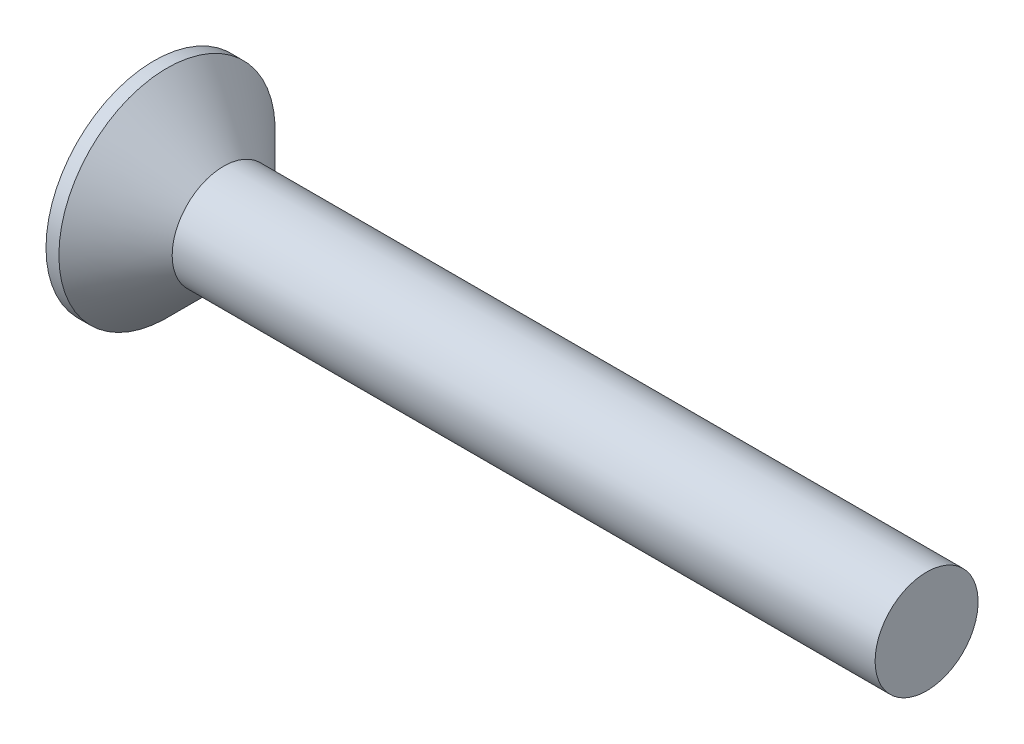
ISO-10303-21;
HEADER;
FILE_DESCRIPTION(('STEP AP214'),'2;1');
FILE_NAME('part.step','',(''),(''),'','','');
FILE_SCHEMA(('AUTOMOTIVE_DESIGN { 1 0 10303 214 1 1 1 1 }'));
ENDSEC;
DATA;
#1=APPLICATION_CONTEXT('core data for automotive mechanical design processes');
#2=APPLICATION_PROTOCOL_DEFINITION('international standard','automotive_design',2000,#1);
#3=PRODUCT_CONTEXT('',#1,'mechanical');
#4=PRODUCT('Part','Part','',(#3));
#5=PRODUCT_RELATED_PRODUCT_CATEGORY('part','',(#4));
#6=PRODUCT_DEFINITION_FORMATION('','',#4);
#7=PRODUCT_DEFINITION_CONTEXT('part definition',#1,'design');
#8=PRODUCT_DEFINITION('design','',#6,#7);
#9=PRODUCT_DEFINITION_SHAPE('','',#8);
#10=(LENGTH_UNIT() NAMED_UNIT(*) SI_UNIT(.MILLI.,.METRE.));
#11=(NAMED_UNIT(*) PLANE_ANGLE_UNIT() SI_UNIT($,.RADIAN.));
#12=(NAMED_UNIT(*) SI_UNIT($,.STERADIAN.) SOLID_ANGLE_UNIT());
#13=UNCERTAINTY_MEASURE_WITH_UNIT(LENGTH_MEASURE(1.E-05),#10,'distance_accuracy_value','');
#14=(GEOMETRIC_REPRESENTATION_CONTEXT(3) GLOBAL_UNCERTAINTY_ASSIGNED_CONTEXT((#13)) GLOBAL_UNIT_ASSIGNED_CONTEXT((#10,
#11,#12)) REPRESENTATION_CONTEXT('',''));
#15=CARTESIAN_POINT('',(0.,0.,0.));
#16=DIRECTION('',(0.,0.,1.));
#17=DIRECTION('',(1.,0.,0.));
#18=AXIS2_PLACEMENT_3D('',#15,#16,#17);
#19=CARTESIAN_POINT('',(0.,4.2,0.));
#20=DIRECTION('',(1.,0.,0.));
#21=DIRECTION('',(0.,0.,-1.));
#22=AXIS2_PLACEMENT_3D('',#19,#20,#21);
#23=PLANE('',#22);
#24=CARTESIAN_POINT('',(0.,0.,0.));
#25=DIRECTION('',(-1.,0.,0.));
#26=DIRECTION('',(0.,0.,1.));
#27=AXIS2_PLACEMENT_3D('',#24,#25,#26);
#28=CIRCLE('',#27,4.2);
#29=CARTESIAN_POINT('',(0.,0.,4.2));
#30=VERTEX_POINT('',#29);
#31=EDGE_CURVE('E44',#30,#30,#28,.T.);
#32=ORIENTED_EDGE('',*,*,#31,.T.);
#33=EDGE_LOOP('',(#32));
#34=FACE_BOUND('',#33,.T.);
#35=ADVANCED_FACE('F30',(#34),#23,.F.);
#36=CARTESIAN_POINT('',(30.,0.,0.));
#37=DIRECTION('',(-1.,0.,0.));
#38=DIRECTION('',(0.,0.,1.));
#39=AXIS2_PLACEMENT_3D('',#36,#37,#38);
#40=PLANE('',#39);
#41=CARTESIAN_POINT('',(30.,0.,0.));
#42=DIRECTION('',(-1.,0.,0.));
#43=DIRECTION('',(0.,0.,1.));
#44=AXIS2_PLACEMENT_3D('',#41,#42,#43);
#45=CIRCLE('',#44,2.);
#46=CARTESIAN_POINT('',(30.,0.,2.));
#47=VERTEX_POINT('',#46);
#48=EDGE_CURVE('E10',#47,#47,#45,.T.);
#49=ORIENTED_EDGE('',*,*,#48,.F.);
#50=EDGE_LOOP('',(#49));
#51=FACE_BOUND('',#50,.T.);
#52=ADVANCED_FACE('F64',(#51),#40,.F.);
#53=CARTESIAN_POINT('',(0.,0.,0.));
#54=DIRECTION('',(-1.,0.,0.));
#55=DIRECTION('',(0.,0.,1.));
#56=AXIS2_PLACEMENT_3D('',#53,#54,#55);
#57=CYLINDRICAL_SURFACE('',#56,2.);
#58=CARTESIAN_POINT('',(2.7,0.,0.));
#59=DIRECTION('',(-1.,0.,0.));
#60=DIRECTION('',(0.,0.,1.));
#61=AXIS2_PLACEMENT_3D('',#58,#59,#60);
#62=CIRCLE('',#61,2.);
#63=CARTESIAN_POINT('',(2.7,0.,2.));
#64=VERTEX_POINT('',#63);
#65=EDGE_CURVE('E36',#64,#64,#62,.T.);
#66=ORIENTED_EDGE('',*,*,#65,.F.);
#67=EDGE_LOOP('',(#66));
#68=FACE_BOUND('',#67,.T.);
#69=ORIENTED_EDGE('',*,*,#48,.T.);
#70=EDGE_LOOP('',(#69));
#71=FACE_BOUND('',#70,.T.);
#72=ADVANCED_FACE('F59',(#68,#71),#57,.T.);
#73=CARTESIAN_POINT('',(2.7,0.,0.));
#74=DIRECTION('',(-1.,0.,0.));
#75=DIRECTION('',(0.,0.,1.));
#76=AXIS2_PLACEMENT_3D('',#73,#74,#75);
#77=CONICAL_SURFACE('',#76,2.,0.78539816339745);
#78=CARTESIAN_POINT('',(0.500000000000005,0.,0.));
#79=DIRECTION('',(-1.,0.,0.));
#80=DIRECTION('',(0.,0.,1.));
#81=AXIS2_PLACEMENT_3D('',#78,#79,#80);
#82=CIRCLE('',#81,4.2);
#83=CARTESIAN_POINT('',(0.500000000000005,0.,4.2));
#84=VERTEX_POINT('',#83);
#85=EDGE_CURVE('E40',#84,#84,#82,.T.);
#86=ORIENTED_EDGE('',*,*,#85,.F.);
#87=EDGE_LOOP('',(#86));
#88=FACE_BOUND('',#87,.T.);
#89=ORIENTED_EDGE('',*,*,#65,.T.);
#90=EDGE_LOOP('',(#89));
#91=FACE_BOUND('',#90,.T.);
#92=ADVANCED_FACE('F54',(#88,#91),#77,.T.);
#93=CARTESIAN_POINT('',(0.,0.,0.));
#94=DIRECTION('',(-1.,0.,0.));
#95=DIRECTION('',(0.,0.,1.));
#96=AXIS2_PLACEMENT_3D('',#93,#94,#95);
#97=CYLINDRICAL_SURFACE('',#96,4.2);
#98=ORIENTED_EDGE('',*,*,#31,.F.);
#99=EDGE_LOOP('',(#98));
#100=FACE_BOUND('',#99,.T.);
#101=ORIENTED_EDGE('',*,*,#85,.T.);
#102=EDGE_LOOP('',(#101));
#103=FACE_BOUND('',#102,.T.);
#104=ADVANCED_FACE('F51',(#100,#103),#97,.T.);
#105=CLOSED_SHELL('',(#35,#52,#72,#92,#104));
#106=MANIFOLD_SOLID_BREP('B2',#105);
#107=ADVANCED_BREP_SHAPE_REPRESENTATION('',(#18,#106),#14);
#108=SHAPE_DEFINITION_REPRESENTATION(#9,#107);
ENDSEC;
END-ISO-10303-21;
